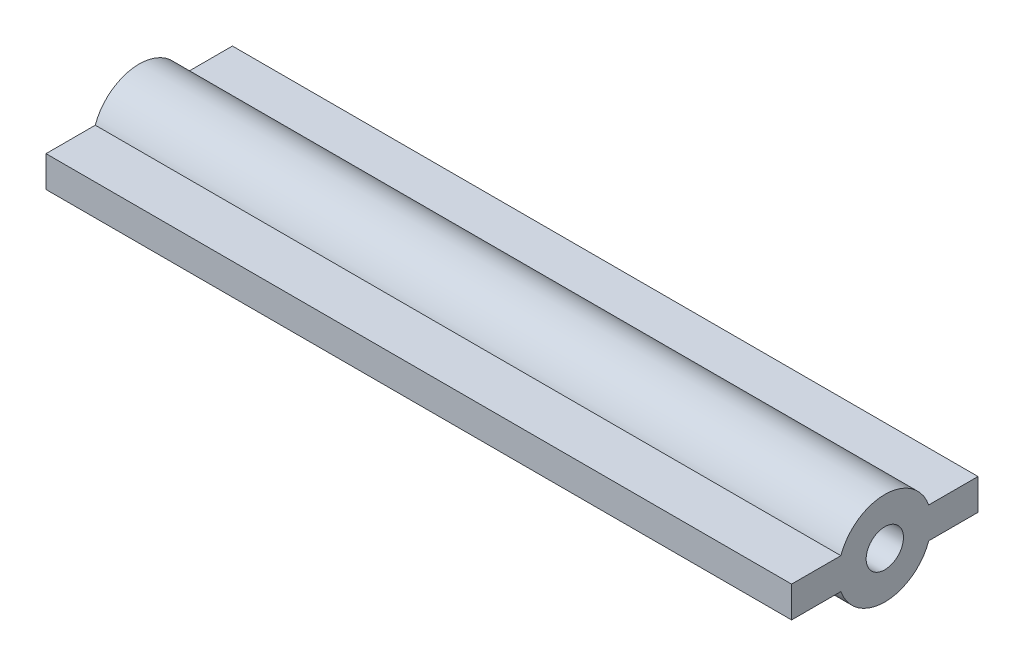
ISO-10303-21;
HEADER;
FILE_DESCRIPTION(('STEP AP214'),'2;1');
FILE_NAME('part.step','',(''),(''),'','','');
FILE_SCHEMA(('AUTOMOTIVE_DESIGN { 1 0 10303 214 1 1 1 1 }'));
ENDSEC;
DATA;
#1=APPLICATION_CONTEXT('core data for automotive mechanical design processes');
#2=APPLICATION_PROTOCOL_DEFINITION('international standard','automotive_design',2000,#1);
#3=PRODUCT_CONTEXT('',#1,'mechanical');
#4=PRODUCT('Part','Part','',(#3));
#5=PRODUCT_RELATED_PRODUCT_CATEGORY('part','',(#4));
#6=PRODUCT_DEFINITION_FORMATION('','',#4);
#7=PRODUCT_DEFINITION_CONTEXT('part definition',#1,'design');
#8=PRODUCT_DEFINITION('design','',#6,#7);
#9=PRODUCT_DEFINITION_SHAPE('','',#8);
#10=(LENGTH_UNIT() NAMED_UNIT(*) SI_UNIT(.MILLI.,.METRE.));
#11=(NAMED_UNIT(*) PLANE_ANGLE_UNIT() SI_UNIT($,.RADIAN.));
#12=(NAMED_UNIT(*) SI_UNIT($,.STERADIAN.) SOLID_ANGLE_UNIT());
#13=UNCERTAINTY_MEASURE_WITH_UNIT(LENGTH_MEASURE(1.E-05),#10,'distance_accuracy_value','');
#14=(GEOMETRIC_REPRESENTATION_CONTEXT(3) GLOBAL_UNCERTAINTY_ASSIGNED_CONTEXT((#13)) GLOBAL_UNIT_ASSIGNED_CONTEXT((#10,
#11,#12)) REPRESENTATION_CONTEXT('',''));
#15=CARTESIAN_POINT('',(0.,0.,0.));
#16=DIRECTION('',(0.,0.,1.));
#17=DIRECTION('',(1.,0.,0.));
#18=AXIS2_PLACEMENT_3D('',#15,#16,#17);
#19=CARTESIAN_POINT('',(120.,0.,0.));
#20=DIRECTION('',(1.,0.,0.));
#21=DIRECTION('',(0.,0.,-1.));
#22=AXIS2_PLACEMENT_3D('',#19,#20,#21);
#23=PLANE('',#22);
#24=DIRECTION('',(0.,-1.,0.));
#25=VECTOR('',#24,1.);
#26=CARTESIAN_POINT('',(120.,2.5,15.));
#27=LINE('',#26,#25);
#28=CARTESIAN_POINT('',(120.,2.5,15.));
#29=VERTEX_POINT('',#28);
#30=CARTESIAN_POINT('',(120.,-2.5,15.));
#31=VERTEX_POINT('',#30);
#32=EDGE_CURVE('E161',#29,#31,#27,.T.);
#33=ORIENTED_EDGE('',*,*,#32,.T.);
#34=DIRECTION('',(0.,0.,-1.));
#35=VECTOR('',#34,1.);
#36=CARTESIAN_POINT('',(120.,-2.5,15.));
#37=LINE('',#36,#35);
#38=CARTESIAN_POINT('',(120.,-2.5,7.07106781186548));
#39=VERTEX_POINT('',#38);
#40=EDGE_CURVE('E101',#31,#39,#37,.T.);
#41=ORIENTED_EDGE('',*,*,#40,.T.);
#42=CARTESIAN_POINT('',(120.,0.,0.));
#43=DIRECTION('',(1.,0.,0.));
#44=DIRECTION('',(0.,0.,-1.));
#45=AXIS2_PLACEMENT_3D('',#42,#43,#44);
#46=CIRCLE('',#45,7.5);
#47=CARTESIAN_POINT('',(120.,-2.5,-7.07106781186548));
#48=VERTEX_POINT('',#47);
#49=EDGE_CURVE('E177',#39,#48,#46,.T.);
#50=ORIENTED_EDGE('',*,*,#49,.T.);
#51=DIRECTION('',(0.,0.,-1.));
#52=VECTOR('',#51,1.);
#53=CARTESIAN_POINT('',(120.,-2.5,-7.07106781186548));
#54=LINE('',#53,#52);
#55=CARTESIAN_POINT('',(120.,-2.5,-15.));
#56=VERTEX_POINT('',#55);
#57=EDGE_CURVE('E189',#48,#56,#54,.T.);
#58=ORIENTED_EDGE('',*,*,#57,.T.);
#59=DIRECTION('',(0.,1.,0.));
#60=VECTOR('',#59,1.);
#61=CARTESIAN_POINT('',(120.,2.5,-15.));
#62=LINE('',#61,#60);
#63=CARTESIAN_POINT('',(120.,2.5,-15.));
#64=VERTEX_POINT('',#63);
#65=EDGE_CURVE('E124',#56,#64,#62,.T.);
#66=ORIENTED_EDGE('',*,*,#65,.T.);
#67=DIRECTION('',(0.,0.,1.));
#68=VECTOR('',#67,1.);
#69=CARTESIAN_POINT('',(120.,2.5,-7.07106781186548));
#70=LINE('',#69,#68);
#71=CARTESIAN_POINT('',(120.,2.5,-7.07106781186548));
#72=VERTEX_POINT('',#71);
#73=EDGE_CURVE('E117',#64,#72,#70,.T.);
#74=ORIENTED_EDGE('',*,*,#73,.T.);
#75=CARTESIAN_POINT('',(120.,0.,0.));
#76=DIRECTION('',(1.,0.,0.));
#77=DIRECTION('',(0.,0.,-1.));
#78=AXIS2_PLACEMENT_3D('',#75,#76,#77);
#79=CIRCLE('',#78,7.5);
#80=CARTESIAN_POINT('',(120.,2.5,7.07106781186548));
#81=VERTEX_POINT('',#80);
#82=EDGE_CURVE('E121',#72,#81,#79,.T.);
#83=ORIENTED_EDGE('',*,*,#82,.T.);
#84=DIRECTION('',(0.,0.,1.));
#85=VECTOR('',#84,1.);
#86=CARTESIAN_POINT('',(120.,2.5,15.));
#87=LINE('',#86,#85);
#88=EDGE_CURVE('E60',#81,#29,#87,.T.);
#89=ORIENTED_EDGE('',*,*,#88,.T.);
#90=EDGE_LOOP('',(#33,#41,#50,#58,#66,#74,#83,#89));
#91=FACE_BOUND('',#90,.T.);
#92=CARTESIAN_POINT('',(120.,0.,0.));
#93=DIRECTION('',(1.,0.,0.));
#94=DIRECTION('',(0.,0.,-1.));
#95=AXIS2_PLACEMENT_3D('',#92,#93,#94);
#96=CIRCLE('',#95,3.);
#97=CARTESIAN_POINT('',(120.,0.,-3.));
#98=VERTEX_POINT('',#97);
#99=EDGE_CURVE('E149',#98,#98,#96,.T.);
#100=ORIENTED_EDGE('',*,*,#99,.F.);
#101=EDGE_LOOP('',(#100));
#102=FACE_BOUND('',#101,.T.);
#103=ADVANCED_FACE('F35',(#91,#102),#23,.T.);
#104=CARTESIAN_POINT('',(0.,0.,0.));
#105=DIRECTION('',(1.,0.,0.));
#106=DIRECTION('',(0.,0.,-1.));
#107=AXIS2_PLACEMENT_3D('',#104,#105,#106);
#108=PLANE('',#107);
#109=DIRECTION('',(0.,-0.908492076321646,-0.417902078555233));
#110=VECTOR('',#109,1.);
#111=CARTESIAN_POINT('',(0.,-0.37315623192999,-4.02418783854645));
#112=LINE('',#111,#110);
#113=CARTESIAN_POINT('',(0.,3.29847078181662,-2.33525669570508));
#114=VERTEX_POINT('',#113);
#115=CARTESIAN_POINT('',(0.,-0.37315623192999,-4.02418783854645));
#116=VERTEX_POINT('',#115);
#117=EDGE_CURVE('E227',#114,#116,#112,.T.);
#118=ORIENTED_EDGE('',*,*,#117,.F.);
#119=DIRECTION('',(0.,-0.0923322218376714,-0.995728256509033));
#120=VECTOR('',#119,1.);
#121=CARTESIAN_POINT('',(0.,3.29847078181662,-2.33525669570508));
#122=LINE('',#121,#120);
#123=CARTESIAN_POINT('',(0.,3.67162701374661,1.68893114284137));
#124=VERTEX_POINT('',#123);
#125=EDGE_CURVE('E51',#124,#114,#122,.T.);
#126=ORIENTED_EDGE('',*,*,#125,.F.);
#127=DIRECTION('',(0.,0.816159854483975,-0.577826177953801));
#128=VECTOR('',#127,1.);
#129=CARTESIAN_POINT('',(0.,3.67162701374661,1.68893114284137));
#130=LINE('',#129,#128);
#131=CARTESIAN_POINT('',(0.,0.37315623192999,4.02418783854645));
#132=VERTEX_POINT('',#131);
#133=EDGE_CURVE('E214',#132,#124,#130,.T.);
#134=ORIENTED_EDGE('',*,*,#133,.F.);
#135=DIRECTION('',(0.,0.908492076321646,0.417902078555233));
#136=VECTOR('',#135,1.);
#137=CARTESIAN_POINT('',(0.,0.37315623192999,4.02418783854645));
#138=LINE('',#137,#136);
#139=CARTESIAN_POINT('',(0.,-3.29847078181662,2.33525669570508));
#140=VERTEX_POINT('',#139);
#141=EDGE_CURVE('E218',#140,#132,#138,.T.);
#142=ORIENTED_EDGE('',*,*,#141,.F.);
#143=DIRECTION('',(0.,0.0923322218376715,0.995728256509033));
#144=VECTOR('',#143,1.);
#145=CARTESIAN_POINT('',(0.,-3.29847078181662,2.33525669570508));
#146=LINE('',#145,#144);
#147=CARTESIAN_POINT('',(0.,-3.67162701374661,-1.68893114284137));
#148=VERTEX_POINT('',#147);
#149=EDGE_CURVE('E221',#148,#140,#146,.T.);
#150=ORIENTED_EDGE('',*,*,#149,.F.);
#151=DIRECTION('',(0.,-0.816159854483975,0.577826177953801));
#152=VECTOR('',#151,1.);
#153=CARTESIAN_POINT('',(0.,-3.67162701374661,-1.68893114284137));
#154=LINE('',#153,#152);
#155=EDGE_CURVE('E224',#116,#148,#154,.T.);
#156=ORIENTED_EDGE('',*,*,#155,.F.);
#157=EDGE_LOOP('',(#118,#126,#134,#142,#150,#156));
#158=FACE_BOUND('',#157,.T.);
#159=DIRECTION('',(0.,-1.,0.));
#160=VECTOR('',#159,1.);
#161=CARTESIAN_POINT('',(0.,2.5,15.));
#162=LINE('',#161,#160);
#163=CARTESIAN_POINT('',(0.,2.5,15.));
#164=VERTEX_POINT('',#163);
#165=CARTESIAN_POINT('',(0.,-2.5,15.));
#166=VERTEX_POINT('',#165);
#167=EDGE_CURVE('E145',#164,#166,#162,.T.);
#168=ORIENTED_EDGE('',*,*,#167,.F.);
#169=DIRECTION('',(0.,0.,1.));
#170=VECTOR('',#169,1.);
#171=CARTESIAN_POINT('',(0.,2.5,15.));
#172=LINE('',#171,#170);
#173=CARTESIAN_POINT('',(0.,2.5,7.07106781186548));
#174=VERTEX_POINT('',#173);
#175=EDGE_CURVE('E93',#174,#164,#172,.T.);
#176=ORIENTED_EDGE('',*,*,#175,.F.);
#177=CARTESIAN_POINT('',(0.,0.,0.));
#178=DIRECTION('',(1.,0.,0.));
#179=DIRECTION('',(0.,0.,-1.));
#180=AXIS2_PLACEMENT_3D('',#177,#178,#179);
#181=CIRCLE('',#180,7.5);
#182=CARTESIAN_POINT('',(0.,2.5,-7.07106781186548));
#183=VERTEX_POINT('',#182);
#184=EDGE_CURVE('E158',#183,#174,#181,.T.);
#185=ORIENTED_EDGE('',*,*,#184,.F.);
#186=DIRECTION('',(0.,0.,1.));
#187=VECTOR('',#186,1.);
#188=CARTESIAN_POINT('',(0.,2.5,-7.07106781186548));
#189=LINE('',#188,#187);
#190=CARTESIAN_POINT('',(0.,2.5,-15.));
#191=VERTEX_POINT('',#190);
#192=EDGE_CURVE('E133',#191,#183,#189,.T.);
#193=ORIENTED_EDGE('',*,*,#192,.F.);
#194=DIRECTION('',(0.,1.,0.));
#195=VECTOR('',#194,1.);
#196=CARTESIAN_POINT('',(0.,2.5,-15.));
#197=LINE('',#196,#195);
#198=CARTESIAN_POINT('',(0.,-2.5,-15.));
#199=VERTEX_POINT('',#198);
#200=EDGE_CURVE('E155',#199,#191,#197,.T.);
#201=ORIENTED_EDGE('',*,*,#200,.F.);
#202=DIRECTION('',(0.,0.,-1.));
#203=VECTOR('',#202,1.);
#204=CARTESIAN_POINT('',(0.,-2.5,-7.07106781186548));
#205=LINE('',#204,#203);
#206=CARTESIAN_POINT('',(0.,-2.5,-7.07106781186548));
#207=VERTEX_POINT('',#206);
#208=EDGE_CURVE('E153',#207,#199,#205,.T.);
#209=ORIENTED_EDGE('',*,*,#208,.F.);
#210=CARTESIAN_POINT('',(0.,0.,0.));
#211=DIRECTION('',(1.,0.,0.));
#212=DIRECTION('',(0.,0.,-1.));
#213=AXIS2_PLACEMENT_3D('',#210,#211,#212);
#214=CIRCLE('',#213,7.5);
#215=CARTESIAN_POINT('',(0.,-2.5,7.07106781186548));
#216=VERTEX_POINT('',#215);
#217=EDGE_CURVE('E151',#216,#207,#214,.T.);
#218=ORIENTED_EDGE('',*,*,#217,.F.);
#219=DIRECTION('',(0.,0.,-1.));
#220=VECTOR('',#219,1.);
#221=CARTESIAN_POINT('',(0.,-2.5,15.));
#222=LINE('',#221,#220);
#223=EDGE_CURVE('E148',#166,#216,#222,.T.);
#224=ORIENTED_EDGE('',*,*,#223,.F.);
#225=EDGE_LOOP('',(#168,#176,#185,#193,#201,#209,#218,#224));
#226=FACE_BOUND('',#225,.T.);
#227=ADVANCED_FACE('F181',(#158,#226),#108,.F.);
#228=CARTESIAN_POINT('',(120.,2.5,15.));
#229=DIRECTION('',(0.,0.,-1.));
#230=DIRECTION('',(-1.,0.,0.));
#231=AXIS2_PLACEMENT_3D('',#228,#229,#230);
#232=PLANE('',#231);
#233=ORIENTED_EDGE('',*,*,#167,.T.);
#234=DIRECTION('',(-1.,0.,0.));
#235=VECTOR('',#234,1.);
#236=CARTESIAN_POINT('',(120.,-2.5,15.));
#237=LINE('',#236,#235);
#238=EDGE_CURVE('E11',#31,#166,#237,.T.);
#239=ORIENTED_EDGE('',*,*,#238,.F.);
#240=ORIENTED_EDGE('',*,*,#32,.F.);
#241=DIRECTION('',(-1.,0.,0.));
#242=VECTOR('',#241,1.);
#243=CARTESIAN_POINT('',(120.,2.5,15.));
#244=LINE('',#243,#242);
#245=EDGE_CURVE('E141',#29,#164,#244,.T.);
#246=ORIENTED_EDGE('',*,*,#245,.T.);
#247=EDGE_LOOP('',(#233,#239,#240,#246));
#248=FACE_BOUND('',#247,.T.);
#249=ADVANCED_FACE('F37',(#248),#232,.F.);
#250=CARTESIAN_POINT('',(120.,-2.5,15.));
#251=DIRECTION('',(0.,1.,0.));
#252=DIRECTION('',(0.,0.,1.));
#253=AXIS2_PLACEMENT_3D('',#250,#251,#252);
#254=PLANE('',#253);
#255=ORIENTED_EDGE('',*,*,#223,.T.);
#256=DIRECTION('',(-1.,0.,0.));
#257=VECTOR('',#256,1.);
#258=CARTESIAN_POINT('',(120.,-2.5,7.07106781186548));
#259=LINE('',#258,#257);
#260=EDGE_CURVE('E44',#39,#216,#259,.T.);
#261=ORIENTED_EDGE('',*,*,#260,.F.);
#262=ORIENTED_EDGE('',*,*,#40,.F.);
#263=ORIENTED_EDGE('',*,*,#238,.T.);
#264=EDGE_LOOP('',(#255,#261,#262,#263));
#265=FACE_BOUND('',#264,.T.);
#266=ADVANCED_FACE('F324',(#265),#254,.F.);
#267=CARTESIAN_POINT('',(120.,0.,0.));
#268=DIRECTION('',(-1.,0.,0.));
#269=DIRECTION('',(0.,0.,1.));
#270=AXIS2_PLACEMENT_3D('',#267,#268,#269);
#271=CYLINDRICAL_SURFACE('',#270,7.5);
#272=ORIENTED_EDGE('',*,*,#217,.T.);
#273=DIRECTION('',(-1.,0.,0.));
#274=VECTOR('',#273,1.);
#275=CARTESIAN_POINT('',(120.,-2.5,-7.07106781186548));
#276=LINE('',#275,#274);
#277=EDGE_CURVE('E168',#48,#207,#276,.T.);
#278=ORIENTED_EDGE('',*,*,#277,.F.);
#279=ORIENTED_EDGE('',*,*,#49,.F.);
#280=ORIENTED_EDGE('',*,*,#260,.T.);
#281=EDGE_LOOP('',(#272,#278,#279,#280));
#282=FACE_BOUND('',#281,.T.);
#283=ADVANCED_FACE('F175',(#282),#271,.T.);
#284=CARTESIAN_POINT('',(120.,-2.5,-7.07106781186548));
#285=DIRECTION('',(0.,1.,0.));
#286=DIRECTION('',(0.,0.,1.));
#287=AXIS2_PLACEMENT_3D('',#284,#285,#286);
#288=PLANE('',#287);
#289=ORIENTED_EDGE('',*,*,#208,.T.);
#290=DIRECTION('',(-1.,0.,0.));
#291=VECTOR('',#290,1.);
#292=CARTESIAN_POINT('',(120.,-2.5,-15.));
#293=LINE('',#292,#291);
#294=EDGE_CURVE('E165',#56,#199,#293,.T.);
#295=ORIENTED_EDGE('',*,*,#294,.F.);
#296=ORIENTED_EDGE('',*,*,#57,.F.);
#297=ORIENTED_EDGE('',*,*,#277,.T.);
#298=EDGE_LOOP('',(#289,#295,#296,#297));
#299=FACE_BOUND('',#298,.T.);
#300=ADVANCED_FACE('F185',(#299),#288,.F.);
#301=CARTESIAN_POINT('',(120.,2.5,-15.));
#302=DIRECTION('',(0.,0.,1.));
#303=DIRECTION('',(1.,0.,0.));
#304=AXIS2_PLACEMENT_3D('',#301,#302,#303);
#305=PLANE('',#304);
#306=ORIENTED_EDGE('',*,*,#200,.T.);
#307=DIRECTION('',(-1.,0.,0.));
#308=VECTOR('',#307,1.);
#309=CARTESIAN_POINT('',(120.,2.5,-15.));
#310=LINE('',#309,#308);
#311=EDGE_CURVE('E136',#64,#191,#310,.T.);
#312=ORIENTED_EDGE('',*,*,#311,.F.);
#313=ORIENTED_EDGE('',*,*,#65,.F.);
#314=ORIENTED_EDGE('',*,*,#294,.T.);
#315=EDGE_LOOP('',(#306,#312,#313,#314));
#316=FACE_BOUND('',#315,.T.);
#317=ADVANCED_FACE('F188',(#316),#305,.F.);
#318=CARTESIAN_POINT('',(120.,2.5,-7.07106781186548));
#319=DIRECTION('',(0.,-1.,0.));
#320=DIRECTION('',(0.,0.,-1.));
#321=AXIS2_PLACEMENT_3D('',#318,#319,#320);
#322=PLANE('',#321);
#323=ORIENTED_EDGE('',*,*,#192,.T.);
#324=DIRECTION('',(-1.,0.,0.));
#325=VECTOR('',#324,1.);
#326=CARTESIAN_POINT('',(120.,2.5,-7.07106781186548));
#327=LINE('',#326,#325);
#328=EDGE_CURVE('E130',#72,#183,#327,.T.);
#329=ORIENTED_EDGE('',*,*,#328,.F.);
#330=ORIENTED_EDGE('',*,*,#73,.F.);
#331=ORIENTED_EDGE('',*,*,#311,.T.);
#332=EDGE_LOOP('',(#323,#329,#330,#331));
#333=FACE_BOUND('',#332,.T.);
#334=ADVANCED_FACE('F131',(#333),#322,.F.);
#335=CARTESIAN_POINT('',(120.,0.,0.));
#336=DIRECTION('',(-1.,0.,0.));
#337=DIRECTION('',(0.,0.,1.));
#338=AXIS2_PLACEMENT_3D('',#335,#336,#337);
#339=CYLINDRICAL_SURFACE('',#338,7.5);
#340=ORIENTED_EDGE('',*,*,#184,.T.);
#341=DIRECTION('',(-1.,0.,0.));
#342=VECTOR('',#341,1.);
#343=CARTESIAN_POINT('',(120.,2.5,7.07106781186548));
#344=LINE('',#343,#342);
#345=EDGE_CURVE('E137',#81,#174,#344,.T.);
#346=ORIENTED_EDGE('',*,*,#345,.F.);
#347=ORIENTED_EDGE('',*,*,#82,.F.);
#348=ORIENTED_EDGE('',*,*,#328,.T.);
#349=EDGE_LOOP('',(#340,#346,#347,#348));
#350=FACE_BOUND('',#349,.T.);
#351=ADVANCED_FACE('F139',(#350),#339,.T.);
#352=CARTESIAN_POINT('',(120.,2.5,15.));
#353=DIRECTION('',(0.,-1.,0.));
#354=DIRECTION('',(0.,0.,-1.));
#355=AXIS2_PLACEMENT_3D('',#352,#353,#354);
#356=PLANE('',#355);
#357=ORIENTED_EDGE('',*,*,#175,.T.);
#358=ORIENTED_EDGE('',*,*,#245,.F.);
#359=ORIENTED_EDGE('',*,*,#88,.F.);
#360=ORIENTED_EDGE('',*,*,#345,.T.);
#361=EDGE_LOOP('',(#357,#358,#359,#360));
#362=FACE_BOUND('',#361,.T.);
#363=ADVANCED_FACE('F312',(#362),#356,.F.);
#364=CARTESIAN_POINT('',(120.,0.,0.));
#365=DIRECTION('',(-1.,0.,0.));
#366=DIRECTION('',(0.,0.,1.));
#367=AXIS2_PLACEMENT_3D('',#364,#365,#366);
#368=CYLINDRICAL_SURFACE('',#367,3.);
#369=CARTESIAN_POINT('',(6.00000000000001,0.,0.));
#370=DIRECTION('',(1.,0.,0.));
#371=DIRECTION('',(0.,0.,-1.));
#372=AXIS2_PLACEMENT_3D('',#369,#370,#371);
#373=CIRCLE('',#372,3.);
#374=CARTESIAN_POINT('',(6.00000000000001,0.,-3.));
#375=VERTEX_POINT('',#374);
#376=EDGE_CURVE('E39',#375,#375,#373,.T.);
#377=ORIENTED_EDGE('',*,*,#376,.F.);
#378=EDGE_LOOP('',(#377));
#379=FACE_BOUND('',#378,.T.);
#380=ORIENTED_EDGE('',*,*,#99,.T.);
#381=EDGE_LOOP('',(#380));
#382=FACE_BOUND('',#381,.T.);
#383=ADVANCED_FACE('F309',(#379,#382),#368,.F.);
#384=CARTESIAN_POINT('',(6.,3.29847078181662,-2.33525669570508));
#385=DIRECTION('',(0.,0.995728256509033,-0.0923322218376714));
#386=DIRECTION('',(0.,0.0923322218376714,0.995728256509033));
#387=AXIS2_PLACEMENT_3D('',#384,#385,#386);
#388=PLANE('',#387);
#389=ORIENTED_EDGE('',*,*,#125,.T.);
#390=DIRECTION('',(-1.,0.,0.));
#391=VECTOR('',#390,1.);
#392=CARTESIAN_POINT('',(6.,3.29847078181662,-2.33525669570508));
#393=LINE('',#392,#391);
#394=CARTESIAN_POINT('',(6.,3.29847078181662,-2.33525669570508));
#395=VERTEX_POINT('',#394);
#396=EDGE_CURVE('E197',#395,#114,#393,.T.);
#397=ORIENTED_EDGE('',*,*,#396,.F.);
#398=DIRECTION('',(0.,-0.0923322218376714,-0.995728256509033));
#399=VECTOR('',#398,1.);
#400=CARTESIAN_POINT('',(6.,3.29847078181662,-2.33525669570508));
#401=LINE('',#400,#399);
#402=CARTESIAN_POINT('',(6.,3.67162701374661,1.68893114284137));
#403=VERTEX_POINT('',#402);
#404=EDGE_CURVE('E217',#403,#395,#401,.T.);
#405=ORIENTED_EDGE('',*,*,#404,.F.);
#406=DIRECTION('',(-1.,0.,0.));
#407=VECTOR('',#406,1.);
#408=CARTESIAN_POINT('',(6.,3.67162701374661,1.68893114284137));
#409=LINE('',#408,#407);
#410=EDGE_CURVE('E212',#403,#124,#409,.T.);
#411=ORIENTED_EDGE('',*,*,#410,.T.);
#412=EDGE_LOOP('',(#389,#397,#405,#411));
#413=FACE_BOUND('',#412,.T.);
#414=ADVANCED_FACE('F254',(#413),#388,.F.);
#415=CARTESIAN_POINT('',(6.,3.67162701374661,1.68893114284137));
#416=DIRECTION('',(0.,0.577826177953801,0.816159854483975));
#417=DIRECTION('',(0.,-0.816159854483975,0.577826177953801));
#418=AXIS2_PLACEMENT_3D('',#415,#416,#417);
#419=PLANE('',#418);
#420=ORIENTED_EDGE('',*,*,#133,.T.);
#421=ORIENTED_EDGE('',*,*,#410,.F.);
#422=DIRECTION('',(0.,0.816159854483975,-0.577826177953801));
#423=VECTOR('',#422,1.);
#424=CARTESIAN_POINT('',(6.,3.67162701374661,1.68893114284137));
#425=LINE('',#424,#423);
#426=CARTESIAN_POINT('',(6.,0.37315623192999,4.02418783854645));
#427=VERTEX_POINT('',#426);
#428=EDGE_CURVE('E200',#427,#403,#425,.T.);
#429=ORIENTED_EDGE('',*,*,#428,.F.);
#430=DIRECTION('',(-1.,0.,0.));
#431=VECTOR('',#430,1.);
#432=CARTESIAN_POINT('',(6.,0.37315623192999,4.02418783854645));
#433=LINE('',#432,#431);
#434=EDGE_CURVE('E209',#427,#132,#433,.T.);
#435=ORIENTED_EDGE('',*,*,#434,.T.);
#436=EDGE_LOOP('',(#420,#421,#429,#435));
#437=FACE_BOUND('',#436,.T.);
#438=ADVANCED_FACE('F270',(#437),#419,.F.);
#439=CARTESIAN_POINT('',(6.,0.37315623192999,4.02418783854645));
#440=DIRECTION('',(0.,-0.417902078555233,0.908492076321646));
#441=DIRECTION('',(0.,-0.908492076321646,-0.417902078555233));
#442=AXIS2_PLACEMENT_3D('',#439,#440,#441);
#443=PLANE('',#442);
#444=ORIENTED_EDGE('',*,*,#141,.T.);
#445=ORIENTED_EDGE('',*,*,#434,.F.);
#446=DIRECTION('',(0.,0.908492076321646,0.417902078555233));
#447=VECTOR('',#446,1.);
#448=CARTESIAN_POINT('',(6.,0.37315623192999,4.02418783854645));
#449=LINE('',#448,#447);
#450=CARTESIAN_POINT('',(6.,-3.29847078181662,2.33525669570508));
#451=VERTEX_POINT('',#450);
#452=EDGE_CURVE('E233',#451,#427,#449,.T.);
#453=ORIENTED_EDGE('',*,*,#452,.F.);
#454=DIRECTION('',(-1.,0.,0.));
#455=VECTOR('',#454,1.);
#456=CARTESIAN_POINT('',(6.,-3.29847078181662,2.33525669570508));
#457=LINE('',#456,#455);
#458=EDGE_CURVE('E206',#451,#140,#457,.T.);
#459=ORIENTED_EDGE('',*,*,#458,.T.);
#460=EDGE_LOOP('',(#444,#445,#453,#459));
#461=FACE_BOUND('',#460,.T.);
#462=ADVANCED_FACE('F275',(#461),#443,.F.);
#463=CARTESIAN_POINT('',(6.,-3.29847078181662,2.33525669570508));
#464=DIRECTION('',(0.,-0.995728256509033,0.0923322218376715));
#465=DIRECTION('',(0.,-0.0923322218376715,-0.995728256509033));
#466=AXIS2_PLACEMENT_3D('',#463,#464,#465);
#467=PLANE('',#466);
#468=ORIENTED_EDGE('',*,*,#149,.T.);
#469=ORIENTED_EDGE('',*,*,#458,.F.);
#470=DIRECTION('',(0.,0.0923322218376715,0.995728256509033));
#471=VECTOR('',#470,1.);
#472=CARTESIAN_POINT('',(6.,-3.29847078181662,2.33525669570508));
#473=LINE('',#472,#471);
#474=CARTESIAN_POINT('',(6.,-3.67162701374661,-1.68893114284137));
#475=VERTEX_POINT('',#474);
#476=EDGE_CURVE('E236',#475,#451,#473,.T.);
#477=ORIENTED_EDGE('',*,*,#476,.F.);
#478=DIRECTION('',(-1.,0.,0.));
#479=VECTOR('',#478,1.);
#480=CARTESIAN_POINT('',(6.,-3.67162701374661,-1.68893114284137));
#481=LINE('',#480,#479);
#482=EDGE_CURVE('E203',#475,#148,#481,.T.);
#483=ORIENTED_EDGE('',*,*,#482,.T.);
#484=EDGE_LOOP('',(#468,#469,#477,#483));
#485=FACE_BOUND('',#484,.T.);
#486=ADVANCED_FACE('F293',(#485),#467,.F.);
#487=CARTESIAN_POINT('',(6.,-3.67162701374661,-1.68893114284137));
#488=DIRECTION('',(0.,-0.577826177953801,-0.816159854483975));
#489=DIRECTION('',(0.,0.816159854483975,-0.577826177953801));
#490=AXIS2_PLACEMENT_3D('',#487,#488,#489);
#491=PLANE('',#490);
#492=ORIENTED_EDGE('',*,*,#155,.T.);
#493=ORIENTED_EDGE('',*,*,#482,.F.);
#494=DIRECTION('',(0.,-0.816159854483975,0.577826177953801));
#495=VECTOR('',#494,1.);
#496=CARTESIAN_POINT('',(6.,-3.67162701374661,-1.68893114284137));
#497=LINE('',#496,#495);
#498=CARTESIAN_POINT('',(6.,-0.37315623192999,-4.02418783854645));
#499=VERTEX_POINT('',#498);
#500=EDGE_CURVE('E239',#499,#475,#497,.T.);
#501=ORIENTED_EDGE('',*,*,#500,.F.);
#502=DIRECTION('',(-1.,0.,0.));
#503=VECTOR('',#502,1.);
#504=CARTESIAN_POINT('',(6.,-0.37315623192999,-4.02418783854645));
#505=LINE('',#504,#503);
#506=EDGE_CURVE('E199',#499,#116,#505,.T.);
#507=ORIENTED_EDGE('',*,*,#506,.T.);
#508=EDGE_LOOP('',(#492,#493,#501,#507));
#509=FACE_BOUND('',#508,.T.);
#510=ADVANCED_FACE('F289',(#509),#491,.F.);
#511=CARTESIAN_POINT('',(6.,-0.37315623192999,-4.02418783854645));
#512=DIRECTION('',(0.,0.417902078555233,-0.908492076321646));
#513=DIRECTION('',(0.,0.908492076321646,0.417902078555233));
#514=AXIS2_PLACEMENT_3D('',#511,#512,#513);
#515=PLANE('',#514);
#516=ORIENTED_EDGE('',*,*,#117,.T.);
#517=ORIENTED_EDGE('',*,*,#506,.F.);
#518=DIRECTION('',(0.,-0.908492076321646,-0.417902078555233));
#519=VECTOR('',#518,1.);
#520=CARTESIAN_POINT('',(6.,-0.37315623192999,-4.02418783854645));
#521=LINE('',#520,#519);
#522=EDGE_CURVE('E242',#395,#499,#521,.T.);
#523=ORIENTED_EDGE('',*,*,#522,.F.);
#524=ORIENTED_EDGE('',*,*,#396,.T.);
#525=EDGE_LOOP('',(#516,#517,#523,#524));
#526=FACE_BOUND('',#525,.T.);
#527=ADVANCED_FACE('F283',(#526),#515,.F.);
#528=CARTESIAN_POINT('',(6.,0.,0.));
#529=DIRECTION('',(1.,0.,0.));
#530=DIRECTION('',(0.,0.,-1.));
#531=AXIS2_PLACEMENT_3D('',#528,#529,#530);
#532=PLANE('',#531);
#533=ORIENTED_EDGE('',*,*,#376,.T.);
#534=EDGE_LOOP('',(#533));
#535=FACE_BOUND('',#534,.T.);
#536=ORIENTED_EDGE('',*,*,#404,.T.);
#537=ORIENTED_EDGE('',*,*,#522,.T.);
#538=ORIENTED_EDGE('',*,*,#500,.T.);
#539=ORIENTED_EDGE('',*,*,#476,.T.);
#540=ORIENTED_EDGE('',*,*,#452,.T.);
#541=ORIENTED_EDGE('',*,*,#428,.T.);
#542=EDGE_LOOP('',(#536,#537,#538,#539,#540,#541));
#543=FACE_BOUND('',#542,.T.);
#544=ADVANCED_FACE('F249',(#535,#543),#532,.F.);
#545=CLOSED_SHELL('',(#103,#227,#249,#266,#283,#300,#317,#334,#351,#363,#383,#414,#438,#462,
#486,#510,#527,#544));
#546=MANIFOLD_SOLID_BREP('B2',#545);
#547=ADVANCED_BREP_SHAPE_REPRESENTATION('',(#18,#546),#14);
#548=SHAPE_DEFINITION_REPRESENTATION(#9,#547);
ENDSEC;
END-ISO-10303-21;
